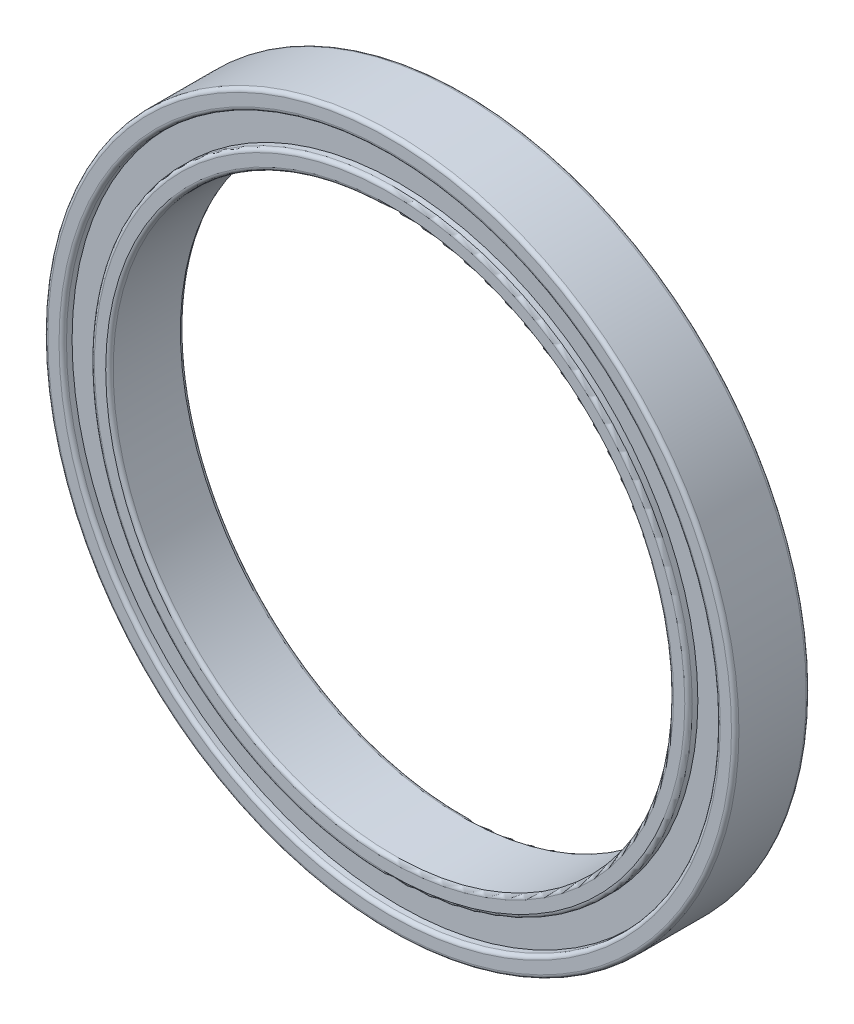
ISO-10303-21;
HEADER;
FILE_DESCRIPTION(('STEP AP214'),'2;1');
FILE_NAME('part.step','',(''),(''),'','','');
FILE_SCHEMA(('AUTOMOTIVE_DESIGN { 1 0 10303 214 1 1 1 1 }'));
ENDSEC;
DATA;
#1=APPLICATION_CONTEXT('core data for automotive mechanical design processes');
#2=APPLICATION_PROTOCOL_DEFINITION('international standard','automotive_design',2000,#1);
#3=PRODUCT_CONTEXT('',#1,'mechanical');
#4=PRODUCT('Part','Part','',(#3));
#5=PRODUCT_RELATED_PRODUCT_CATEGORY('part','',(#4));
#6=PRODUCT_DEFINITION_FORMATION('','',#4);
#7=PRODUCT_DEFINITION_CONTEXT('part definition',#1,'design');
#8=PRODUCT_DEFINITION('design','',#6,#7);
#9=PRODUCT_DEFINITION_SHAPE('','',#8);
#10=(LENGTH_UNIT() NAMED_UNIT(*) SI_UNIT(.MILLI.,.METRE.));
#11=(NAMED_UNIT(*) PLANE_ANGLE_UNIT() SI_UNIT($,.RADIAN.));
#12=(NAMED_UNIT(*) SI_UNIT($,.STERADIAN.) SOLID_ANGLE_UNIT());
#13=UNCERTAINTY_MEASURE_WITH_UNIT(LENGTH_MEASURE(1.E-05),#10,'distance_accuracy_value','');
#14=(GEOMETRIC_REPRESENTATION_CONTEXT(3) GLOBAL_UNCERTAINTY_ASSIGNED_CONTEXT((#13)) GLOBAL_UNIT_ASSIGNED_CONTEXT((#10,
#11,#12)) REPRESENTATION_CONTEXT('',''));
#15=CARTESIAN_POINT('',(0.,0.,0.));
#16=DIRECTION('',(0.,0.,1.));
#17=DIRECTION('',(1.,0.,0.));
#18=AXIS2_PLACEMENT_3D('',#15,#16,#17);
#19=CARTESIAN_POINT('',(0.,0.,0.));
#20=DIRECTION('',(0.,0.,1.));
#21=DIRECTION('',(1.,0.,0.));
#22=AXIS2_PLACEMENT_3D('',#19,#20,#21);
#23=PLANE('',#22);
#24=CARTESIAN_POINT('',(0.,0.,0.));
#25=DIRECTION('',(0.,0.,1.));
#26=DIRECTION('',(1.,0.,0.));
#27=AXIS2_PLACEMENT_3D('',#24,#25,#26);
#28=CIRCLE('',#27,15.8);
#29=CARTESIAN_POINT('',(15.8,0.,0.));
#30=VERTEX_POINT('',#29);
#31=EDGE_CURVE('E32',#30,#30,#28,.F.);
#32=ORIENTED_EDGE('',*,*,#31,.T.);
#33=EDGE_LOOP('',(#32));
#34=FACE_BOUND('',#33,.T.);
#35=CARTESIAN_POINT('',(0.,0.,0.));
#36=DIRECTION('',(0.,0.,1.));
#37=DIRECTION('',(1.,0.,0.));
#38=AXIS2_PLACEMENT_3D('',#35,#36,#37);
#39=CIRCLE('',#38,15.2);
#40=CARTESIAN_POINT('',(15.2,0.,0.));
#41=VERTEX_POINT('',#40);
#42=EDGE_CURVE('E36',#41,#41,#39,.T.);
#43=ORIENTED_EDGE('',*,*,#42,.T.);
#44=EDGE_LOOP('',(#43));
#45=FACE_BOUND('',#44,.T.);
#46=ADVANCED_FACE('F25',(#34,#45),#23,.F.);
#47=CARTESIAN_POINT('',(0.,0.,4.));
#48=DIRECTION('',(0.,0.,1.));
#49=DIRECTION('',(1.,0.,0.));
#50=AXIS2_PLACEMENT_3D('',#47,#48,#49);
#51=PLANE('',#50);
#52=CARTESIAN_POINT('',(0.,0.,4.));
#53=DIRECTION('',(0.,0.,1.));
#54=DIRECTION('',(1.,0.,0.));
#55=AXIS2_PLACEMENT_3D('',#52,#53,#54);
#56=CIRCLE('',#55,15.8);
#57=CARTESIAN_POINT('',(15.8,0.,4.));
#58=VERTEX_POINT('',#57);
#59=EDGE_CURVE('E60',#58,#58,#56,.T.);
#60=ORIENTED_EDGE('',*,*,#59,.T.);
#61=EDGE_LOOP('',(#60));
#62=FACE_BOUND('',#61,.T.);
#63=CARTESIAN_POINT('',(0.,0.,4.));
#64=DIRECTION('',(0.,0.,1.));
#65=DIRECTION('',(1.,0.,0.));
#66=AXIS2_PLACEMENT_3D('',#63,#64,#65);
#67=CIRCLE('',#66,15.2);
#68=CARTESIAN_POINT('',(15.2,0.,4.));
#69=VERTEX_POINT('',#68);
#70=EDGE_CURVE('E63',#69,#69,#67,.F.);
#71=ORIENTED_EDGE('',*,*,#70,.T.);
#72=EDGE_LOOP('',(#71));
#73=FACE_BOUND('',#72,.T.);
#74=ADVANCED_FACE('F115',(#62,#73),#51,.T.);
#75=CARTESIAN_POINT('',(0.,0.,4.));
#76=DIRECTION('',(0.,0.,1.));
#77=DIRECTION('',(1.,0.,0.));
#78=AXIS2_PLACEMENT_3D('',#75,#76,#77);
#79=CIRCLE('',#78,18.3);
#80=CARTESIAN_POINT('',(18.3,0.,4.));
#81=VERTEX_POINT('',#80);
#82=EDGE_CURVE('E75',#81,#81,#79,.T.);
#83=ORIENTED_EDGE('',*,*,#82,.T.);
#84=EDGE_LOOP('',(#83));
#85=FACE_BOUND('',#84,.T.);
#86=CARTESIAN_POINT('',(0.,0.,4.));
#87=DIRECTION('',(0.,0.,1.));
#88=DIRECTION('',(1.,0.,0.));
#89=AXIS2_PLACEMENT_3D('',#86,#87,#88);
#90=CIRCLE('',#89,17.7);
#91=CARTESIAN_POINT('',(17.7,0.,4.));
#92=VERTEX_POINT('',#91);
#93=EDGE_CURVE('E78',#92,#92,#90,.F.);
#94=ORIENTED_EDGE('',*,*,#93,.T.);
#95=EDGE_LOOP('',(#94));
#96=FACE_BOUND('',#95,.T.);
#97=ADVANCED_FACE('F121',(#85,#96),#51,.T.);
#98=CARTESIAN_POINT('',(0.,0.,0.));
#99=DIRECTION('',(0.,0.,1.));
#100=DIRECTION('',(1.,0.,0.));
#101=AXIS2_PLACEMENT_3D('',#98,#99,#100);
#102=CIRCLE('',#101,18.3);
#103=CARTESIAN_POINT('',(18.3,0.,0.));
#104=VERTEX_POINT('',#103);
#105=EDGE_CURVE('E45',#104,#104,#102,.F.);
#106=ORIENTED_EDGE('',*,*,#105,.T.);
#107=EDGE_LOOP('',(#106));
#108=FACE_BOUND('',#107,.T.);
#109=CARTESIAN_POINT('',(0.,0.,0.));
#110=DIRECTION('',(0.,0.,1.));
#111=DIRECTION('',(1.,0.,0.));
#112=AXIS2_PLACEMENT_3D('',#109,#110,#111);
#113=CIRCLE('',#112,17.7);
#114=CARTESIAN_POINT('',(17.7,0.,0.));
#115=VERTEX_POINT('',#114);
#116=EDGE_CURVE('E48',#115,#115,#113,.T.);
#117=ORIENTED_EDGE('',*,*,#116,.T.);
#118=EDGE_LOOP('',(#117));
#119=FACE_BOUND('',#118,.T.);
#120=ADVANCED_FACE('F117',(#108,#119),#23,.F.);
#121=CARTESIAN_POINT('',(0.,0.,4.));
#122=DIRECTION('',(0.,0.,-1.));
#123=DIRECTION('',(-1.,0.,0.));
#124=AXIS2_PLACEMENT_3D('',#121,#122,#123);
#125=CYLINDRICAL_SURFACE('',#124,18.5);
#126=CARTESIAN_POINT('',(0.,0.,3.8));
#127=DIRECTION('',(0.,0.,1.));
#128=DIRECTION('',(1.,0.,0.));
#129=AXIS2_PLACEMENT_3D('',#126,#127,#128);
#130=CIRCLE('',#129,18.5);
#131=CARTESIAN_POINT('',(18.5,0.,3.8));
#132=VERTEX_POINT('',#131);
#133=EDGE_CURVE('E69',#132,#132,#130,.F.);
#134=ORIENTED_EDGE('',*,*,#133,.T.);
#135=EDGE_LOOP('',(#134));
#136=FACE_BOUND('',#135,.T.);
#137=CARTESIAN_POINT('',(0.,0.,0.2));
#138=DIRECTION('',(0.,0.,1.));
#139=DIRECTION('',(1.,0.,0.));
#140=AXIS2_PLACEMENT_3D('',#137,#138,#139);
#141=CIRCLE('',#140,18.5);
#142=CARTESIAN_POINT('',(18.5,0.,0.2));
#143=VERTEX_POINT('',#142);
#144=EDGE_CURVE('E72',#143,#143,#141,.T.);
#145=ORIENTED_EDGE('',*,*,#144,.T.);
#146=EDGE_LOOP('',(#145));
#147=FACE_BOUND('',#146,.T.);
#148=ADVANCED_FACE('F27',(#136,#147),#125,.T.);
#149=CARTESIAN_POINT('',(0.,0.,4.));
#150=DIRECTION('',(0.,0.,-1.));
#151=DIRECTION('',(-1.,0.,0.));
#152=AXIS2_PLACEMENT_3D('',#149,#150,#151);
#153=CYLINDRICAL_SURFACE('',#152,15.);
#154=CARTESIAN_POINT('',(0.,0.,3.8));
#155=DIRECTION('',(0.,0.,1.));
#156=DIRECTION('',(1.,0.,0.));
#157=AXIS2_PLACEMENT_3D('',#154,#155,#156);
#158=CIRCLE('',#157,15.);
#159=CARTESIAN_POINT('',(15.,0.,3.8));
#160=VERTEX_POINT('',#159);
#161=EDGE_CURVE('E51',#160,#160,#158,.T.);
#162=ORIENTED_EDGE('',*,*,#161,.T.);
#163=EDGE_LOOP('',(#162));
#164=FACE_BOUND('',#163,.T.);
#165=CARTESIAN_POINT('',(0.,0.,0.2));
#166=DIRECTION('',(0.,0.,1.));
#167=DIRECTION('',(1.,0.,0.));
#168=AXIS2_PLACEMENT_3D('',#165,#166,#167);
#169=CIRCLE('',#168,15.);
#170=CARTESIAN_POINT('',(15.,0.,0.2));
#171=VERTEX_POINT('',#170);
#172=EDGE_CURVE('E54',#171,#171,#169,.F.);
#173=ORIENTED_EDGE('',*,*,#172,.T.);
#174=EDGE_LOOP('',(#173));
#175=FACE_BOUND('',#174,.T.);
#176=ADVANCED_FACE('F131',(#164,#175),#153,.F.);
#177=CARTESIAN_POINT('',(0.,0.,3.5));
#178=DIRECTION('',(0.,0.,1.));
#179=DIRECTION('',(1.,0.,0.));
#180=AXIS2_PLACEMENT_3D('',#177,#178,#179);
#181=CYLINDRICAL_SURFACE('',#180,17.5);
#182=CARTESIAN_POINT('',(0.,0.,3.8));
#183=DIRECTION('',(0.,0.,1.));
#184=DIRECTION('',(1.,0.,0.));
#185=AXIS2_PLACEMENT_3D('',#182,#183,#184);
#186=CIRCLE('',#185,17.5);
#187=CARTESIAN_POINT('',(17.5,0.,3.8));
#188=VERTEX_POINT('',#187);
#189=EDGE_CURVE('E66',#188,#188,#186,.T.);
#190=ORIENTED_EDGE('',*,*,#189,.T.);
#191=EDGE_LOOP('',(#190));
#192=FACE_BOUND('',#191,.T.);
#193=CARTESIAN_POINT('',(0.,0.,3.5));
#194=DIRECTION('',(0.,0.,1.));
#195=DIRECTION('',(1.,0.,0.));
#196=AXIS2_PLACEMENT_3D('',#193,#194,#195);
#197=CIRCLE('',#196,17.5);
#198=CARTESIAN_POINT('',(17.5,0.,3.5));
#199=VERTEX_POINT('',#198);
#200=EDGE_CURVE('E81',#199,#199,#197,.T.);
#201=ORIENTED_EDGE('',*,*,#200,.F.);
#202=EDGE_LOOP('',(#201));
#203=FACE_BOUND('',#202,.T.);
#204=ADVANCED_FACE('F214',(#192,#203),#181,.F.);
#205=CARTESIAN_POINT('',(0.,0.,3.5));
#206=DIRECTION('',(0.,0.,1.));
#207=DIRECTION('',(1.,0.,0.));
#208=AXIS2_PLACEMENT_3D('',#205,#206,#207);
#209=PLANE('',#208);
#210=CARTESIAN_POINT('',(0.,0.,3.5));
#211=DIRECTION('',(0.,0.,1.));
#212=DIRECTION('',(1.,0.,0.));
#213=AXIS2_PLACEMENT_3D('',#210,#211,#212);
#214=CIRCLE('',#213,16.);
#215=CARTESIAN_POINT('',(16.,0.,3.5));
#216=VERTEX_POINT('',#215);
#217=EDGE_CURVE('E84',#216,#216,#214,.T.);
#218=ORIENTED_EDGE('',*,*,#217,.F.);
#219=EDGE_LOOP('',(#218));
#220=FACE_BOUND('',#219,.T.);
#221=ORIENTED_EDGE('',*,*,#200,.T.);
#222=EDGE_LOOP('',(#221));
#223=FACE_BOUND('',#222,.T.);
#224=ADVANCED_FACE('F111',(#220,#223),#209,.T.);
#225=CARTESIAN_POINT('',(0.,0.,3.5));
#226=DIRECTION('',(0.,0.,1.));
#227=DIRECTION('',(1.,0.,0.));
#228=AXIS2_PLACEMENT_3D('',#225,#226,#227);
#229=CYLINDRICAL_SURFACE('',#228,16.);
#230=CARTESIAN_POINT('',(0.,0.,3.8));
#231=DIRECTION('',(0.,0.,1.));
#232=DIRECTION('',(1.,0.,0.));
#233=AXIS2_PLACEMENT_3D('',#230,#231,#232);
#234=CIRCLE('',#233,16.);
#235=CARTESIAN_POINT('',(16.,0.,3.8));
#236=VERTEX_POINT('',#235);
#237=EDGE_CURVE('E57',#236,#236,#234,.F.);
#238=ORIENTED_EDGE('',*,*,#237,.T.);
#239=EDGE_LOOP('',(#238));
#240=FACE_BOUND('',#239,.T.);
#241=ORIENTED_EDGE('',*,*,#217,.T.);
#242=EDGE_LOOP('',(#241));
#243=FACE_BOUND('',#242,.T.);
#244=ADVANCED_FACE('F104',(#240,#243),#229,.T.);
#245=CARTESIAN_POINT('',(0.,0.,0.5));
#246=DIRECTION('',(0.,0.,-1.));
#247=DIRECTION('',(-1.,0.,0.));
#248=AXIS2_PLACEMENT_3D('',#245,#246,#247);
#249=CYLINDRICAL_SURFACE('',#248,17.5);
#250=CARTESIAN_POINT('',(0.,0.,0.2));
#251=DIRECTION('',(0.,0.,1.));
#252=DIRECTION('',(1.,0.,0.));
#253=AXIS2_PLACEMENT_3D('',#250,#251,#252);
#254=CIRCLE('',#253,17.5);
#255=CARTESIAN_POINT('',(17.5,0.,0.2));
#256=VERTEX_POINT('',#255);
#257=EDGE_CURVE('E40',#256,#256,#254,.F.);
#258=ORIENTED_EDGE('',*,*,#257,.T.);
#259=EDGE_LOOP('',(#258));
#260=FACE_BOUND('',#259,.T.);
#261=CARTESIAN_POINT('',(0.,0.,0.5));
#262=DIRECTION('',(0.,0.,-1.));
#263=DIRECTION('',(-1.,0.,0.));
#264=AXIS2_PLACEMENT_3D('',#261,#262,#263);
#265=CIRCLE('',#264,17.5);
#266=CARTESIAN_POINT('',(-17.5,0.,0.5));
#267=VERTEX_POINT('',#266);
#268=EDGE_CURVE('E87',#267,#267,#265,.T.);
#269=ORIENTED_EDGE('',*,*,#268,.F.);
#270=EDGE_LOOP('',(#269));
#271=FACE_BOUND('',#270,.T.);
#272=ADVANCED_FACE('F99',(#260,#271),#249,.F.);
#273=CARTESIAN_POINT('',(0.,0.,0.5));
#274=DIRECTION('',(0.,0.,-1.));
#275=DIRECTION('',(-1.,0.,0.));
#276=AXIS2_PLACEMENT_3D('',#273,#274,#275);
#277=PLANE('',#276);
#278=CARTESIAN_POINT('',(0.,0.,0.5));
#279=DIRECTION('',(0.,0.,-1.));
#280=DIRECTION('',(-1.,0.,0.));
#281=AXIS2_PLACEMENT_3D('',#278,#279,#280);
#282=CIRCLE('',#281,16.);
#283=CARTESIAN_POINT('',(-16.,0.,0.5));
#284=VERTEX_POINT('',#283);
#285=EDGE_CURVE('E90',#284,#284,#282,.T.);
#286=ORIENTED_EDGE('',*,*,#285,.F.);
#287=EDGE_LOOP('',(#286));
#288=FACE_BOUND('',#287,.T.);
#289=ORIENTED_EDGE('',*,*,#268,.T.);
#290=EDGE_LOOP('',(#289));
#291=FACE_BOUND('',#290,.T.);
#292=ADVANCED_FACE('F96',(#288,#291),#277,.T.);
#293=CARTESIAN_POINT('',(0.,0.,0.5));
#294=DIRECTION('',(0.,0.,-1.));
#295=DIRECTION('',(-1.,0.,0.));
#296=AXIS2_PLACEMENT_3D('',#293,#294,#295);
#297=CYLINDRICAL_SURFACE('',#296,16.);
#298=CARTESIAN_POINT('',(0.,0.,0.2));
#299=DIRECTION('',(0.,0.,1.));
#300=DIRECTION('',(1.,0.,0.));
#301=AXIS2_PLACEMENT_3D('',#298,#299,#300);
#302=CIRCLE('',#301,16.);
#303=CARTESIAN_POINT('',(16.,0.,0.2));
#304=VERTEX_POINT('',#303);
#305=EDGE_CURVE('E10',#304,#304,#302,.T.);
#306=ORIENTED_EDGE('',*,*,#305,.T.);
#307=EDGE_LOOP('',(#306));
#308=FACE_BOUND('',#307,.T.);
#309=ORIENTED_EDGE('',*,*,#285,.T.);
#310=EDGE_LOOP('',(#309));
#311=FACE_BOUND('',#310,.T.);
#312=ADVANCED_FACE('F94',(#308,#311),#297,.T.);
#313=CARTESIAN_POINT('',(0.,0.,3.8));
#314=DIRECTION('',(0.,0.,1.));
#315=DIRECTION('',(1.,0.,0.));
#316=AXIS2_PLACEMENT_3D('',#313,#314,#315);
#317=TOROIDAL_SURFACE('',#316,18.3,0.2);
#318=ORIENTED_EDGE('',*,*,#133,.F.);
#319=EDGE_LOOP('',(#318));
#320=FACE_BOUND('',#319,.T.);
#321=ORIENTED_EDGE('',*,*,#82,.F.);
#322=EDGE_LOOP('',(#321));
#323=FACE_BOUND('',#322,.T.);
#324=ADVANCED_FACE('F167',(#320,#323),#317,.T.);
#325=CARTESIAN_POINT('',(0.,0.,3.8));
#326=DIRECTION('',(0.,0.,1.));
#327=DIRECTION('',(1.,0.,0.));
#328=AXIS2_PLACEMENT_3D('',#325,#326,#327);
#329=TOROIDAL_SURFACE('',#328,17.7,0.2);
#330=ORIENTED_EDGE('',*,*,#93,.F.);
#331=EDGE_LOOP('',(#330));
#332=FACE_BOUND('',#331,.T.);
#333=ORIENTED_EDGE('',*,*,#189,.F.);
#334=EDGE_LOOP('',(#333));
#335=FACE_BOUND('',#334,.T.);
#336=ADVANCED_FACE('F163',(#332,#335),#329,.T.);
#337=CARTESIAN_POINT('',(0.,0.,3.8));
#338=DIRECTION('',(0.,0.,1.));
#339=DIRECTION('',(1.,0.,0.));
#340=AXIS2_PLACEMENT_3D('',#337,#338,#339);
#341=TOROIDAL_SURFACE('',#340,15.8,0.2);
#342=ORIENTED_EDGE('',*,*,#237,.F.);
#343=EDGE_LOOP('',(#342));
#344=FACE_BOUND('',#343,.T.);
#345=ORIENTED_EDGE('',*,*,#59,.F.);
#346=EDGE_LOOP('',(#345));
#347=FACE_BOUND('',#346,.T.);
#348=ADVANCED_FACE('F159',(#344,#347),#341,.T.);
#349=CARTESIAN_POINT('',(0.,0.,3.8));
#350=DIRECTION('',(0.,0.,1.));
#351=DIRECTION('',(1.,0.,0.));
#352=AXIS2_PLACEMENT_3D('',#349,#350,#351);
#353=TOROIDAL_SURFACE('',#352,15.2,0.2);
#354=ORIENTED_EDGE('',*,*,#70,.F.);
#355=EDGE_LOOP('',(#354));
#356=FACE_BOUND('',#355,.T.);
#357=ORIENTED_EDGE('',*,*,#161,.F.);
#358=EDGE_LOOP('',(#357));
#359=FACE_BOUND('',#358,.T.);
#360=ADVANCED_FACE('F152',(#356,#359),#353,.T.);
#361=CARTESIAN_POINT('',(0.,0.,0.2));
#362=DIRECTION('',(0.,0.,1.));
#363=DIRECTION('',(1.,0.,0.));
#364=AXIS2_PLACEMENT_3D('',#361,#362,#363);
#365=TOROIDAL_SURFACE('',#364,18.3,0.2);
#366=ORIENTED_EDGE('',*,*,#105,.F.);
#367=EDGE_LOOP('',(#366));
#368=FACE_BOUND('',#367,.T.);
#369=ORIENTED_EDGE('',*,*,#144,.F.);
#370=EDGE_LOOP('',(#369));
#371=FACE_BOUND('',#370,.T.);
#372=ADVANCED_FACE('F142',(#368,#371),#365,.T.);
#373=CARTESIAN_POINT('',(0.,0.,0.2));
#374=DIRECTION('',(0.,0.,1.));
#375=DIRECTION('',(1.,0.,0.));
#376=AXIS2_PLACEMENT_3D('',#373,#374,#375);
#377=TOROIDAL_SURFACE('',#376,17.7,0.2);
#378=ORIENTED_EDGE('',*,*,#116,.F.);
#379=EDGE_LOOP('',(#378));
#380=FACE_BOUND('',#379,.T.);
#381=ORIENTED_EDGE('',*,*,#257,.F.);
#382=EDGE_LOOP('',(#381));
#383=FACE_BOUND('',#382,.T.);
#384=ADVANCED_FACE('F138',(#380,#383),#377,.T.);
#385=CARTESIAN_POINT('',(0.,0.,0.2));
#386=DIRECTION('',(0.,0.,1.));
#387=DIRECTION('',(1.,0.,0.));
#388=AXIS2_PLACEMENT_3D('',#385,#386,#387);
#389=TOROIDAL_SURFACE('',#388,15.8,0.2);
#390=ORIENTED_EDGE('',*,*,#305,.F.);
#391=EDGE_LOOP('',(#390));
#392=FACE_BOUND('',#391,.T.);
#393=ORIENTED_EDGE('',*,*,#31,.F.);
#394=EDGE_LOOP('',(#393));
#395=FACE_BOUND('',#394,.T.);
#396=ADVANCED_FACE('F141',(#392,#395),#389,.T.);
#397=CARTESIAN_POINT('',(0.,0.,0.2));
#398=DIRECTION('',(0.,0.,1.));
#399=DIRECTION('',(1.,0.,0.));
#400=AXIS2_PLACEMENT_3D('',#397,#398,#399);
#401=TOROIDAL_SURFACE('',#400,15.2,0.2);
#402=ORIENTED_EDGE('',*,*,#172,.F.);
#403=EDGE_LOOP('',(#402));
#404=FACE_BOUND('',#403,.T.);
#405=ORIENTED_EDGE('',*,*,#42,.F.);
#406=EDGE_LOOP('',(#405));
#407=FACE_BOUND('',#406,.T.);
#408=ADVANCED_FACE('F149',(#404,#407),#401,.T.);
#409=CLOSED_SHELL('',(#46,#74,#97,#120,#148,#176,#204,#224,#244,#272,#292,#312,#324,#336,#348,
#360,#372,#384,#396,#408));
#410=MANIFOLD_SOLID_BREP('B2',#409);
#411=ADVANCED_BREP_SHAPE_REPRESENTATION('',(#18,#410),#14);
#412=SHAPE_DEFINITION_REPRESENTATION(#9,#411);
ENDSEC;
END-ISO-10303-21;
